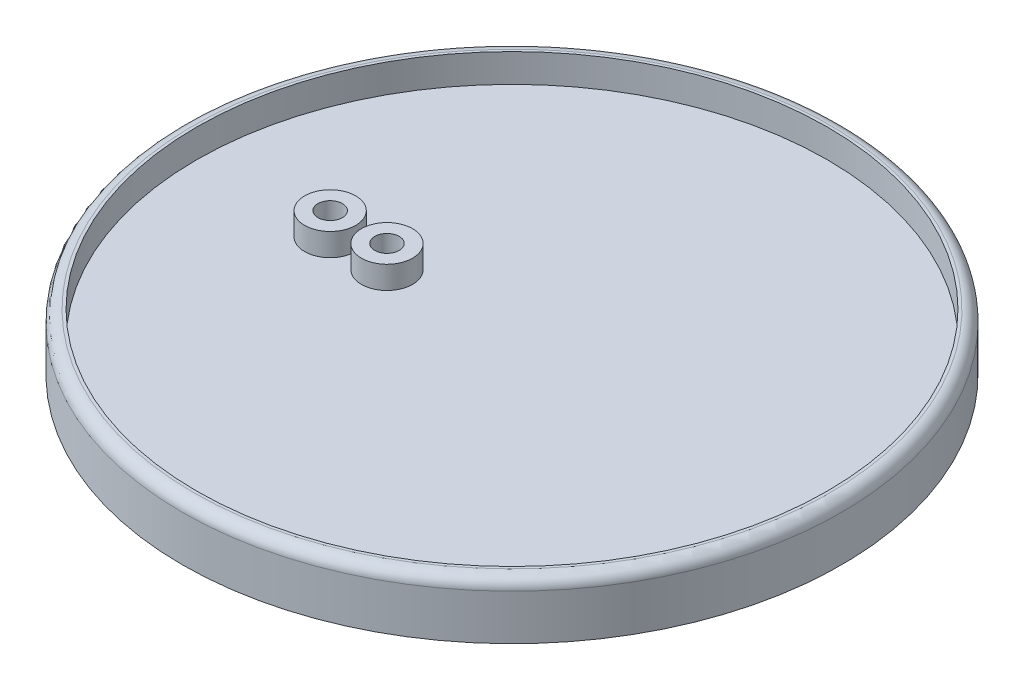
ISO-10303-21;
HEADER;
FILE_DESCRIPTION(('STEP AP214'),'2;1');
FILE_NAME('part.step','',(''),(''),'','','');
FILE_SCHEMA(('AUTOMOTIVE_DESIGN { 1 0 10303 214 1 1 1 1 }'));
ENDSEC;
DATA;
#1=APPLICATION_CONTEXT('core data for automotive mechanical design processes');
#2=APPLICATION_PROTOCOL_DEFINITION('international standard','automotive_design',2000,#1);
#3=PRODUCT_CONTEXT('',#1,'mechanical');
#4=PRODUCT('Part','Part','',(#3));
#5=PRODUCT_RELATED_PRODUCT_CATEGORY('part','',(#4));
#6=PRODUCT_DEFINITION_FORMATION('','',#4);
#7=PRODUCT_DEFINITION_CONTEXT('part definition',#1,'design');
#8=PRODUCT_DEFINITION('design','',#6,#7);
#9=PRODUCT_DEFINITION_SHAPE('','',#8);
#10=(LENGTH_UNIT() NAMED_UNIT(*) SI_UNIT(.MILLI.,.METRE.));
#11=(NAMED_UNIT(*) PLANE_ANGLE_UNIT() SI_UNIT($,.RADIAN.));
#12=(NAMED_UNIT(*) SI_UNIT($,.STERADIAN.) SOLID_ANGLE_UNIT());
#13=UNCERTAINTY_MEASURE_WITH_UNIT(LENGTH_MEASURE(1.E-05),#10,'distance_accuracy_value','');
#14=(GEOMETRIC_REPRESENTATION_CONTEXT(3) GLOBAL_UNCERTAINTY_ASSIGNED_CONTEXT((#13)) GLOBAL_UNIT_ASSIGNED_CONTEXT((#10,
#11,#12)) REPRESENTATION_CONTEXT('',''));
#15=CARTESIAN_POINT('',(0.,0.,0.));
#16=DIRECTION('',(0.,0.,1.));
#17=DIRECTION('',(1.,0.,0.));
#18=AXIS2_PLACEMENT_3D('',#15,#16,#17);
#19=CARTESIAN_POINT('',(0.,5.,0.));
#20=DIRECTION('',(0.,-1.,0.));
#21=DIRECTION('',(0.,0.,-1.));
#22=AXIS2_PLACEMENT_3D('',#19,#20,#21);
#23=CYLINDRICAL_SURFACE('',#22,58.);
#24=CARTESIAN_POINT('',(0.,8.,0.));
#25=DIRECTION('',(0.,1.,0.));
#26=DIRECTION('',(0.,0.,1.));
#27=AXIS2_PLACEMENT_3D('',#24,#25,#26);
#28=CIRCLE('',#27,58.);
#29=CARTESIAN_POINT('',(0.,8.,58.));
#30=VERTEX_POINT('',#29);
#31=EDGE_CURVE('E10',#30,#30,#28,.F.);
#32=ORIENTED_EDGE('',*,*,#31,.T.);
#33=EDGE_LOOP('',(#32));
#34=FACE_BOUND('',#33,.T.);
#35=CARTESIAN_POINT('',(0.,0.,0.));
#36=DIRECTION('',(0.,1.,0.));
#37=DIRECTION('',(0.,0.,1.));
#38=AXIS2_PLACEMENT_3D('',#35,#36,#37);
#39=CIRCLE('',#38,58.);
#40=CARTESIAN_POINT('',(0.,0.,58.));
#41=VERTEX_POINT('',#40);
#42=EDGE_CURVE('E68',#41,#41,#39,.T.);
#43=ORIENTED_EDGE('',*,*,#42,.T.);
#44=EDGE_LOOP('',(#43));
#45=FACE_BOUND('',#44,.T.);
#46=ADVANCED_FACE('F39',(#34,#45),#23,.T.);
#47=CARTESIAN_POINT('',(-22.,0.,0.));
#48=DIRECTION('',(0.,1.,0.));
#49=DIRECTION('',(0.,0.,1.));
#50=AXIS2_PLACEMENT_3D('',#47,#48,#49);
#51=PLANE('',#50);
#52=CARTESIAN_POINT('',(-22.,0.,0.));
#53=DIRECTION('',(0.,1.,0.));
#54=DIRECTION('',(0.,0.,1.));
#55=AXIS2_PLACEMENT_3D('',#52,#53,#54);
#56=CIRCLE('',#55,4.5);
#57=CARTESIAN_POINT('',(-22.,0.,-4.5));
#58=VERTEX_POINT('',#57);
#59=EDGE_CURVE('E93',#58,#58,#56,.T.);
#60=ORIENTED_EDGE('',*,*,#59,.T.);
#61=EDGE_LOOP('',(#60));
#62=FACE_BOUND('',#61,.T.);
#63=CARTESIAN_POINT('',(-32.,0.,0.));
#64=DIRECTION('',(0.,1.,0.));
#65=DIRECTION('',(0.,0.,1.));
#66=AXIS2_PLACEMENT_3D('',#63,#64,#65);
#67=CIRCLE('',#66,4.5);
#68=CARTESIAN_POINT('',(-32.,0.,-4.5));
#69=VERTEX_POINT('',#68);
#70=EDGE_CURVE('E90',#69,#69,#67,.T.);
#71=ORIENTED_EDGE('',*,*,#70,.T.);
#72=EDGE_LOOP('',(#71));
#73=FACE_BOUND('',#72,.T.);
#74=ORIENTED_EDGE('',*,*,#42,.F.);
#75=EDGE_LOOP('',(#74));
#76=FACE_BOUND('',#75,.T.);
#77=ADVANCED_FACE('F114',(#62,#73,#76),#51,.F.);
#78=CARTESIAN_POINT('',(0.,10.,0.));
#79=DIRECTION('',(0.,1.,0.));
#80=DIRECTION('',(0.,0.,1.));
#81=AXIS2_PLACEMENT_3D('',#78,#79,#80);
#82=PLANE('',#81);
#83=CARTESIAN_POINT('',(0.,10.,0.));
#84=DIRECTION('',(0.,1.,0.));
#85=DIRECTION('',(0.,0.,1.));
#86=AXIS2_PLACEMENT_3D('',#83,#84,#85);
#87=CIRCLE('',#86,56.);
#88=CARTESIAN_POINT('',(0.,10.,56.));
#89=VERTEX_POINT('',#88);
#90=EDGE_CURVE('E46',#89,#89,#87,.T.);
#91=ORIENTED_EDGE('',*,*,#90,.T.);
#92=EDGE_LOOP('',(#91));
#93=FACE_BOUND('',#92,.T.);
#94=CARTESIAN_POINT('',(0.,10.,0.));
#95=DIRECTION('',(0.,1.,0.));
#96=DIRECTION('',(0.,0.,1.));
#97=AXIS2_PLACEMENT_3D('',#94,#95,#96);
#98=CIRCLE('',#97,55.5);
#99=CARTESIAN_POINT('',(0.,10.,55.5));
#100=VERTEX_POINT('',#99);
#101=EDGE_CURVE('E78',#100,#100,#98,.T.);
#102=ORIENTED_EDGE('',*,*,#101,.F.);
#103=EDGE_LOOP('',(#102));
#104=FACE_BOUND('',#103,.T.);
#105=ADVANCED_FACE('F119',(#93,#104),#82,.T.);
#106=CARTESIAN_POINT('',(0.,10.,0.));
#107=DIRECTION('',(0.,-1.,0.));
#108=DIRECTION('',(0.,0.,-1.));
#109=AXIS2_PLACEMENT_3D('',#106,#107,#108);
#110=CYLINDRICAL_SURFACE('',#109,55.5);
#111=CARTESIAN_POINT('',(0.,5.,0.));
#112=DIRECTION('',(0.,1.,0.));
#113=DIRECTION('',(0.,0.,1.));
#114=AXIS2_PLACEMENT_3D('',#111,#112,#113);
#115=CIRCLE('',#114,55.5);
#116=CARTESIAN_POINT('',(0.,5.,55.5));
#117=VERTEX_POINT('',#116);
#118=EDGE_CURVE('E50',#117,#117,#115,.F.);
#119=ORIENTED_EDGE('',*,*,#118,.T.);
#120=EDGE_LOOP('',(#119));
#121=FACE_BOUND('',#120,.T.);
#122=ORIENTED_EDGE('',*,*,#101,.T.);
#123=EDGE_LOOP('',(#122));
#124=FACE_BOUND('',#123,.T.);
#125=ADVANCED_FACE('F151',(#121,#124),#110,.F.);
#126=CARTESIAN_POINT('',(-32.,9.,0.));
#127=DIRECTION('',(0.,1.,0.));
#128=DIRECTION('',(0.,0.,1.));
#129=AXIS2_PLACEMENT_3D('',#126,#127,#128);
#130=PLANE('',#129);
#131=CARTESIAN_POINT('',(-32.,9.,0.));
#132=DIRECTION('',(0.,1.,0.));
#133=DIRECTION('',(0.,0.,1.));
#134=AXIS2_PLACEMENT_3D('',#131,#132,#133);
#135=CIRCLE('',#134,2.15);
#136=CARTESIAN_POINT('',(-32.,9.,2.15));
#137=VERTEX_POINT('',#136);
#138=EDGE_CURVE('E60',#137,#137,#135,.T.);
#139=ORIENTED_EDGE('',*,*,#138,.F.);
#140=EDGE_LOOP('',(#139));
#141=FACE_BOUND('',#140,.T.);
#142=CARTESIAN_POINT('',(-32.,9.,0.));
#143=DIRECTION('',(0.,1.,0.));
#144=DIRECTION('',(0.,0.,1.));
#145=AXIS2_PLACEMENT_3D('',#142,#143,#144);
#146=CIRCLE('',#145,4.5);
#147=CARTESIAN_POINT('',(-32.,9.,4.5));
#148=VERTEX_POINT('',#147);
#149=EDGE_CURVE('E76',#148,#148,#146,.T.);
#150=ORIENTED_EDGE('',*,*,#149,.T.);
#151=EDGE_LOOP('',(#150));
#152=FACE_BOUND('',#151,.T.);
#153=ADVANCED_FACE('F130',(#141,#152),#130,.T.);
#154=CARTESIAN_POINT('',(-22.,9.,0.));
#155=DIRECTION('',(0.,1.,0.));
#156=DIRECTION('',(0.,0.,1.));
#157=AXIS2_PLACEMENT_3D('',#154,#155,#156);
#158=PLANE('',#157);
#159=CARTESIAN_POINT('',(-22.,9.,0.));
#160=DIRECTION('',(0.,1.,0.));
#161=DIRECTION('',(0.,0.,1.));
#162=AXIS2_PLACEMENT_3D('',#159,#160,#161);
#163=CIRCLE('',#162,2.15);
#164=CARTESIAN_POINT('',(-22.,9.,2.15));
#165=VERTEX_POINT('',#164);
#166=EDGE_CURVE('E82',#165,#165,#163,.T.);
#167=ORIENTED_EDGE('',*,*,#166,.F.);
#168=EDGE_LOOP('',(#167));
#169=FACE_BOUND('',#168,.T.);
#170=CARTESIAN_POINT('',(-22.,9.,0.));
#171=DIRECTION('',(0.,1.,0.));
#172=DIRECTION('',(0.,0.,1.));
#173=AXIS2_PLACEMENT_3D('',#170,#171,#172);
#174=CIRCLE('',#173,4.5);
#175=CARTESIAN_POINT('',(-22.,9.,4.5));
#176=VERTEX_POINT('',#175);
#177=EDGE_CURVE('E54',#176,#176,#174,.T.);
#178=ORIENTED_EDGE('',*,*,#177,.T.);
#179=EDGE_LOOP('',(#178));
#180=FACE_BOUND('',#179,.T.);
#181=ADVANCED_FACE('F127',(#169,#180),#158,.T.);
#182=CARTESIAN_POINT('',(-32.,9.,0.));
#183=DIRECTION('',(0.,-1.,0.));
#184=DIRECTION('',(0.,0.,-1.));
#185=AXIS2_PLACEMENT_3D('',#182,#183,#184);
#186=CYLINDRICAL_SURFACE('',#185,4.5);
#187=CARTESIAN_POINT('',(-32.,5.,0.));
#188=DIRECTION('',(0.,1.,0.));
#189=DIRECTION('',(0.,0.,1.));
#190=AXIS2_PLACEMENT_3D('',#187,#188,#189);
#191=CIRCLE('',#190,4.5);
#192=CARTESIAN_POINT('',(-32.,5.,4.5));
#193=VERTEX_POINT('',#192);
#194=EDGE_CURVE('E73',#193,#193,#191,.F.);
#195=ORIENTED_EDGE('',*,*,#194,.F.);
#196=EDGE_LOOP('',(#195));
#197=FACE_BOUND('',#196,.T.);
#198=ORIENTED_EDGE('',*,*,#149,.F.);
#199=EDGE_LOOP('',(#198));
#200=FACE_BOUND('',#199,.T.);
#201=ADVANCED_FACE('F129',(#197,#200),#186,.T.);
#202=CARTESIAN_POINT('',(-22.,9.,0.));
#203=DIRECTION('',(0.,-1.,0.));
#204=DIRECTION('',(0.,0.,-1.));
#205=AXIS2_PLACEMENT_3D('',#202,#203,#204);
#206=CYLINDRICAL_SURFACE('',#205,4.5);
#207=CARTESIAN_POINT('',(-22.,5.,0.));
#208=DIRECTION('',(0.,1.,0.));
#209=DIRECTION('',(0.,0.,1.));
#210=AXIS2_PLACEMENT_3D('',#207,#208,#209);
#211=CIRCLE('',#210,4.5);
#212=CARTESIAN_POINT('',(-22.,5.,4.5));
#213=VERTEX_POINT('',#212);
#214=EDGE_CURVE('E65',#213,#213,#211,.T.);
#215=ORIENTED_EDGE('',*,*,#214,.T.);
#216=EDGE_LOOP('',(#215));
#217=FACE_BOUND('',#216,.T.);
#218=ORIENTED_EDGE('',*,*,#177,.F.);
#219=EDGE_LOOP('',(#218));
#220=FACE_BOUND('',#219,.T.);
#221=ADVANCED_FACE('F132',(#217,#220),#206,.T.);
#222=CARTESIAN_POINT('',(0.,5.,0.));
#223=DIRECTION('',(0.,1.,0.));
#224=DIRECTION('',(0.,0.,1.));
#225=AXIS2_PLACEMENT_3D('',#222,#223,#224);
#226=PLANE('',#225);
#227=ORIENTED_EDGE('',*,*,#214,.F.);
#228=EDGE_LOOP('',(#227));
#229=FACE_BOUND('',#228,.T.);
#230=ORIENTED_EDGE('',*,*,#194,.T.);
#231=EDGE_LOOP('',(#230));
#232=FACE_BOUND('',#231,.T.);
#233=ORIENTED_EDGE('',*,*,#118,.F.);
#234=EDGE_LOOP('',(#233));
#235=FACE_BOUND('',#234,.T.);
#236=ADVANCED_FACE('F125',(#229,#232,#235),#226,.T.);
#237=CARTESIAN_POINT('',(-22.,9.,0.));
#238=DIRECTION('',(0.,-1.,0.));
#239=DIRECTION('',(0.,0.,-1.));
#240=AXIS2_PLACEMENT_3D('',#237,#238,#239);
#241=CYLINDRICAL_SURFACE('',#240,2.15);
#242=CARTESIAN_POINT('',(-22.,2.7,0.));
#243=DIRECTION('',(0.,1.,0.));
#244=DIRECTION('',(0.,0.,1.));
#245=AXIS2_PLACEMENT_3D('',#242,#243,#244);
#246=CIRCLE('',#245,2.15);
#247=CARTESIAN_POINT('',(-22.,2.7,2.15));
#248=VERTEX_POINT('',#247);
#249=EDGE_CURVE('E57',#248,#248,#246,.T.);
#250=ORIENTED_EDGE('',*,*,#249,.F.);
#251=EDGE_LOOP('',(#250));
#252=FACE_BOUND('',#251,.T.);
#253=ORIENTED_EDGE('',*,*,#166,.T.);
#254=EDGE_LOOP('',(#253));
#255=FACE_BOUND('',#254,.T.);
#256=ADVANCED_FACE('F139',(#252,#255),#241,.F.);
#257=CARTESIAN_POINT('',(-32.,9.,0.));
#258=DIRECTION('',(0.,-1.,0.));
#259=DIRECTION('',(0.,0.,-1.));
#260=AXIS2_PLACEMENT_3D('',#257,#258,#259);
#261=CYLINDRICAL_SURFACE('',#260,2.15);
#262=CARTESIAN_POINT('',(-32.,2.7,0.));
#263=DIRECTION('',(0.,1.,0.));
#264=DIRECTION('',(0.,0.,1.));
#265=AXIS2_PLACEMENT_3D('',#262,#263,#264);
#266=CIRCLE('',#265,2.15);
#267=CARTESIAN_POINT('',(-32.,2.7,2.15));
#268=VERTEX_POINT('',#267);
#269=EDGE_CURVE('E61',#268,#268,#266,.T.);
#270=ORIENTED_EDGE('',*,*,#269,.F.);
#271=EDGE_LOOP('',(#270));
#272=FACE_BOUND('',#271,.T.);
#273=ORIENTED_EDGE('',*,*,#138,.T.);
#274=EDGE_LOOP('',(#273));
#275=FACE_BOUND('',#274,.T.);
#276=ADVANCED_FACE('F172',(#272,#275),#261,.F.);
#277=CARTESIAN_POINT('',(-32.,2.7,0.));
#278=DIRECTION('',(0.,-1.,0.));
#279=DIRECTION('',(0.,0.,-1.));
#280=AXIS2_PLACEMENT_3D('',#277,#278,#279);
#281=CYLINDRICAL_SURFACE('',#280,4.5);
#282=CARTESIAN_POINT('',(-32.,2.7,0.));
#283=DIRECTION('',(0.,1.,0.));
#284=DIRECTION('',(0.,0.,1.));
#285=AXIS2_PLACEMENT_3D('',#282,#283,#284);
#286=CIRCLE('',#285,4.5);
#287=CARTESIAN_POINT('',(-32.,2.7,-4.5));
#288=VERTEX_POINT('',#287);
#289=EDGE_CURVE('E87',#288,#288,#286,.T.);
#290=CARTESIAN_POINT('',(-32.,2.7,-4.5));
#291=CARTESIAN_POINT('',(-32.,2.671875,-4.5));
#292=CARTESIAN_POINT('',(-32.,2.64375,-4.5));
#293=CARTESIAN_POINT('',(-32.,2.5875,-4.5));
#294=CARTESIAN_POINT('',(-32.,2.559375,-4.5));
#295=CARTESIAN_POINT('',(-32.,2.503125,-4.5));
#296=CARTESIAN_POINT('',(-32.,2.475,-4.5));
#297=CARTESIAN_POINT('',(-32.,2.41875,-4.5));
#298=CARTESIAN_POINT('',(-32.,2.390625,-4.5));
#299=CARTESIAN_POINT('',(-32.,2.334375,-4.5));
#300=CARTESIAN_POINT('',(-32.,2.30625,-4.5));
#301=CARTESIAN_POINT('',(-32.,2.25,-4.5));
#302=CARTESIAN_POINT('',(-32.,2.221875,-4.5));
#303=CARTESIAN_POINT('',(-32.,2.165625,-4.5));
#304=CARTESIAN_POINT('',(-32.,2.1375,-4.5));
#305=CARTESIAN_POINT('',(-32.,2.08125,-4.5));
#306=CARTESIAN_POINT('',(-32.,2.053125,-4.5));
#307=CARTESIAN_POINT('',(-32.,1.996875,-4.5));
#308=CARTESIAN_POINT('',(-32.,1.96875,-4.5));
#309=CARTESIAN_POINT('',(-32.,1.9125,-4.5));
#310=CARTESIAN_POINT('',(-32.,1.884375,-4.5));
#311=CARTESIAN_POINT('',(-32.,1.828125,-4.5));
#312=CARTESIAN_POINT('',(-32.,1.8,-4.5));
#313=CARTESIAN_POINT('',(-32.,1.74375,-4.5));
#314=CARTESIAN_POINT('',(-32.,1.715625,-4.5));
#315=CARTESIAN_POINT('',(-32.,1.659375,-4.5));
#316=CARTESIAN_POINT('',(-32.,1.63125,-4.5));
#317=CARTESIAN_POINT('',(-32.,1.575,-4.5));
#318=CARTESIAN_POINT('',(-32.,1.546875,-4.5));
#319=CARTESIAN_POINT('',(-32.,1.490625,-4.5));
#320=CARTESIAN_POINT('',(-32.,1.4625,-4.5));
#321=CARTESIAN_POINT('',(-32.,1.40625,-4.5));
#322=CARTESIAN_POINT('',(-32.,1.378125,-4.5));
#323=CARTESIAN_POINT('',(-32.,1.321875,-4.5));
#324=CARTESIAN_POINT('',(-32.,1.29375,-4.5));
#325=CARTESIAN_POINT('',(-32.,1.2375,-4.5));
#326=CARTESIAN_POINT('',(-32.,1.209375,-4.5));
#327=CARTESIAN_POINT('',(-32.,1.153125,-4.5));
#328=CARTESIAN_POINT('',(-32.,1.125,-4.5));
#329=CARTESIAN_POINT('',(-32.,1.06875,-4.5));
#330=CARTESIAN_POINT('',(-32.,1.040625,-4.5));
#331=CARTESIAN_POINT('',(-32.,0.984375,-4.5));
#332=CARTESIAN_POINT('',(-32.,0.956249999999999,-4.5));
#333=CARTESIAN_POINT('',(-32.,0.899999999999999,-4.5));
#334=CARTESIAN_POINT('',(-32.,0.871875,-4.5));
#335=CARTESIAN_POINT('',(-32.,0.815624999999999,-4.5));
#336=CARTESIAN_POINT('',(-32.,0.787499999999999,-4.5));
#337=CARTESIAN_POINT('',(-32.,0.73125,-4.5));
#338=CARTESIAN_POINT('',(-32.,0.703125,-4.5));
#339=CARTESIAN_POINT('',(-32.,0.646875,-4.5));
#340=CARTESIAN_POINT('',(-32.,0.61875,-4.5));
#341=CARTESIAN_POINT('',(-32.,0.5625,-4.5));
#342=CARTESIAN_POINT('',(-32.,0.534375,-4.5));
#343=CARTESIAN_POINT('',(-32.,0.478125,-4.5));
#344=CARTESIAN_POINT('',(-32.,0.45,-4.5));
#345=CARTESIAN_POINT('',(-32.,0.39375,-4.5));
#346=CARTESIAN_POINT('',(-32.,0.365625,-4.5));
#347=CARTESIAN_POINT('',(-32.,0.309375,-4.5));
#348=CARTESIAN_POINT('',(-32.,0.28125,-4.5));
#349=CARTESIAN_POINT('',(-32.,0.225,-4.5));
#350=CARTESIAN_POINT('',(-32.,0.196875,-4.5));
#351=CARTESIAN_POINT('',(-32.,0.140625,-4.5));
#352=CARTESIAN_POINT('',(-32.,0.1125,-4.5));
#353=CARTESIAN_POINT('',(-32.,0.0562499999999997,-4.5));
#354=CARTESIAN_POINT('',(-32.,0.0281249999999996,-4.5));
#355=CARTESIAN_POINT('',(-32.,0.,-4.5));
#356=B_SPLINE_CURVE_WITH_KNOTS('',3,(#290,#291,#292,#293,#294,#295,#296,#297,#298,#299,#300,
#301,#302,#303,#304,#305,#306,#307,#308,#309,#310,#311,#312,#313,#314,#315,#316,#317,#318,#319,
#320,#321,#322,#323,#324,#325,#326,#327,#328,#329,#330,#331,#332,#333,#334,#335,#336,#337,#338,
#339,#340,#341,#342,#343,#344,#345,#346,#347,#348,#349,#350,#351,#352,#353,#354,#355),
.UNSPECIFIED.,.F.,.F.,(4,2,2,2,2,2,2,2,2,2,2,2,2,2,2,2,2,2,2,2,2,2,2,2,2,2,2,2,2,2,2,2,4),(0.,
0.0843750000000003,0.16875,0.253125,0.3375,0.421875,0.50625,0.590625,0.675,0.759375,0.84375,
0.928125000000001,1.0125,1.096875,1.18125,1.265625,1.35,1.434375,1.51875,1.603125,1.6875,
1.771875,1.85625,1.940625,2.025,2.109375,2.19375,2.278125,2.3625,2.446875,2.53125,2.615625,2.7),.UNSPECIFIED.);
#357=EDGE_CURVE('BSEAM174',#288,#69,#356,.T.);
#358=ORIENTED_EDGE('',*,*,#289,.T.);
#359=ORIENTED_EDGE('',*,*,#70,.F.);
#360=ORIENTED_EDGE('',*,*,#357,.T.);
#361=ORIENTED_EDGE('',*,*,#357,.F.);
#362=EDGE_LOOP('',(#358,#360,#359,#361));
#363=FACE_BOUND('',#362,.T.);
#364=ADVANCED_FACE('F174',(#363),#281,.F.);
#365=CARTESIAN_POINT('',(-32.,2.7,0.));
#366=DIRECTION('',(0.,1.,0.));
#367=DIRECTION('',(0.,0.,1.));
#368=AXIS2_PLACEMENT_3D('',#365,#366,#367);
#369=PLANE('',#368);
#370=ORIENTED_EDGE('',*,*,#269,.T.);
#371=EDGE_LOOP('',(#370));
#372=FACE_BOUND('',#371,.T.);
#373=ORIENTED_EDGE('',*,*,#289,.F.);
#374=EDGE_LOOP('',(#373));
#375=FACE_BOUND('',#374,.T.);
#376=ADVANCED_FACE('F111',(#372,#375),#369,.F.);
#377=CARTESIAN_POINT('',(-22.,2.7,0.));
#378=DIRECTION('',(0.,-1.,0.));
#379=DIRECTION('',(0.,0.,-1.));
#380=AXIS2_PLACEMENT_3D('',#377,#378,#379);
#381=CYLINDRICAL_SURFACE('',#380,4.5);
#382=CARTESIAN_POINT('',(-22.,2.7,0.));
#383=DIRECTION('',(0.,1.,0.));
#384=DIRECTION('',(0.,0.,1.));
#385=AXIS2_PLACEMENT_3D('',#382,#383,#384);
#386=CIRCLE('',#385,4.5);
#387=CARTESIAN_POINT('',(-22.,2.7,-4.5));
#388=VERTEX_POINT('',#387);
#389=EDGE_CURVE('E64',#388,#388,#386,.T.);
#390=CARTESIAN_POINT('',(-22.,2.7,-4.5));
#391=CARTESIAN_POINT('',(-22.,2.671875,-4.5));
#392=CARTESIAN_POINT('',(-22.,2.64375,-4.5));
#393=CARTESIAN_POINT('',(-22.,2.5875,-4.5));
#394=CARTESIAN_POINT('',(-22.,2.559375,-4.5));
#395=CARTESIAN_POINT('',(-22.,2.503125,-4.5));
#396=CARTESIAN_POINT('',(-22.,2.475,-4.5));
#397=CARTESIAN_POINT('',(-22.,2.41875,-4.5));
#398=CARTESIAN_POINT('',(-22.,2.390625,-4.5));
#399=CARTESIAN_POINT('',(-22.,2.334375,-4.5));
#400=CARTESIAN_POINT('',(-22.,2.30625,-4.5));
#401=CARTESIAN_POINT('',(-22.,2.25,-4.5));
#402=CARTESIAN_POINT('',(-22.,2.221875,-4.5));
#403=CARTESIAN_POINT('',(-22.,2.165625,-4.5));
#404=CARTESIAN_POINT('',(-22.,2.1375,-4.5));
#405=CARTESIAN_POINT('',(-22.,2.08125,-4.5));
#406=CARTESIAN_POINT('',(-22.,2.053125,-4.5));
#407=CARTESIAN_POINT('',(-22.,1.996875,-4.5));
#408=CARTESIAN_POINT('',(-22.,1.96875,-4.5));
#409=CARTESIAN_POINT('',(-22.,1.9125,-4.5));
#410=CARTESIAN_POINT('',(-22.,1.884375,-4.5));
#411=CARTESIAN_POINT('',(-22.,1.828125,-4.5));
#412=CARTESIAN_POINT('',(-22.,1.8,-4.5));
#413=CARTESIAN_POINT('',(-22.,1.74375,-4.5));
#414=CARTESIAN_POINT('',(-22.,1.715625,-4.5));
#415=CARTESIAN_POINT('',(-22.,1.659375,-4.5));
#416=CARTESIAN_POINT('',(-22.,1.63125,-4.5));
#417=CARTESIAN_POINT('',(-22.,1.575,-4.5));
#418=CARTESIAN_POINT('',(-22.,1.546875,-4.5));
#419=CARTESIAN_POINT('',(-22.,1.490625,-4.5));
#420=CARTESIAN_POINT('',(-22.,1.4625,-4.5));
#421=CARTESIAN_POINT('',(-22.,1.40625,-4.5));
#422=CARTESIAN_POINT('',(-22.,1.378125,-4.5));
#423=CARTESIAN_POINT('',(-22.,1.321875,-4.5));
#424=CARTESIAN_POINT('',(-22.,1.29375,-4.5));
#425=CARTESIAN_POINT('',(-22.,1.2375,-4.5));
#426=CARTESIAN_POINT('',(-22.,1.209375,-4.5));
#427=CARTESIAN_POINT('',(-22.,1.153125,-4.5));
#428=CARTESIAN_POINT('',(-22.,1.125,-4.5));
#429=CARTESIAN_POINT('',(-22.,1.06875,-4.5));
#430=CARTESIAN_POINT('',(-22.,1.040625,-4.5));
#431=CARTESIAN_POINT('',(-22.,0.984375,-4.5));
#432=CARTESIAN_POINT('',(-22.,0.956249999999999,-4.5));
#433=CARTESIAN_POINT('',(-22.,0.899999999999999,-4.5));
#434=CARTESIAN_POINT('',(-22.,0.871875,-4.5));
#435=CARTESIAN_POINT('',(-22.,0.815624999999999,-4.5));
#436=CARTESIAN_POINT('',(-22.,0.787499999999999,-4.5));
#437=CARTESIAN_POINT('',(-22.,0.73125,-4.5));
#438=CARTESIAN_POINT('',(-22.,0.703125,-4.5));
#439=CARTESIAN_POINT('',(-22.,0.646875,-4.5));
#440=CARTESIAN_POINT('',(-22.,0.61875,-4.5));
#441=CARTESIAN_POINT('',(-22.,0.5625,-4.5));
#442=CARTESIAN_POINT('',(-22.,0.534375,-4.5));
#443=CARTESIAN_POINT('',(-22.,0.478125,-4.5));
#444=CARTESIAN_POINT('',(-22.,0.45,-4.5));
#445=CARTESIAN_POINT('',(-22.,0.39375,-4.5));
#446=CARTESIAN_POINT('',(-22.,0.365625,-4.5));
#447=CARTESIAN_POINT('',(-22.,0.309375,-4.5));
#448=CARTESIAN_POINT('',(-22.,0.28125,-4.5));
#449=CARTESIAN_POINT('',(-22.,0.225,-4.5));
#450=CARTESIAN_POINT('',(-22.,0.196875,-4.5));
#451=CARTESIAN_POINT('',(-22.,0.140625,-4.5));
#452=CARTESIAN_POINT('',(-22.,0.1125,-4.5));
#453=CARTESIAN_POINT('',(-22.,0.0562499999999997,-4.5));
#454=CARTESIAN_POINT('',(-22.,0.0281249999999996,-4.5));
#455=CARTESIAN_POINT('',(-22.,0.,-4.5));
#456=B_SPLINE_CURVE_WITH_KNOTS('',3,(#390,#391,#392,#393,#394,#395,#396,#397,#398,#399,#400,
#401,#402,#403,#404,#405,#406,#407,#408,#409,#410,#411,#412,#413,#414,#415,#416,#417,#418,#419,
#420,#421,#422,#423,#424,#425,#426,#427,#428,#429,#430,#431,#432,#433,#434,#435,#436,#437,#438,
#439,#440,#441,#442,#443,#444,#445,#446,#447,#448,#449,#450,#451,#452,#453,#454,#455),
.UNSPECIFIED.,.F.,.F.,(4,2,2,2,2,2,2,2,2,2,2,2,2,2,2,2,2,2,2,2,2,2,2,2,2,2,2,2,2,2,2,2,4),(0.,
0.0843750000000003,0.16875,0.253125,0.3375,0.421875,0.50625,0.590625,0.675,0.759375,0.84375,
0.928125000000001,1.0125,1.096875,1.18125,1.265625,1.35,1.434375,1.51875,1.603125,1.6875,
1.771875,1.85625,1.940625,2.025,2.109375,2.19375,2.278125,2.3625,2.446875,2.53125,2.615625,2.7),.UNSPECIFIED.);
#457=EDGE_CURVE('BSEAM99',#388,#58,#456,.T.);
#458=ORIENTED_EDGE('',*,*,#389,.T.);
#459=ORIENTED_EDGE('',*,*,#59,.F.);
#460=ORIENTED_EDGE('',*,*,#457,.T.);
#461=ORIENTED_EDGE('',*,*,#457,.F.);
#462=EDGE_LOOP('',(#458,#460,#459,#461));
#463=FACE_BOUND('',#462,.T.);
#464=ADVANCED_FACE('F99',(#463),#381,.F.);
#465=CARTESIAN_POINT('',(-22.,2.7,0.));
#466=DIRECTION('',(0.,1.,0.));
#467=DIRECTION('',(0.,0.,1.));
#468=AXIS2_PLACEMENT_3D('',#465,#466,#467);
#469=PLANE('',#468);
#470=ORIENTED_EDGE('',*,*,#249,.T.);
#471=EDGE_LOOP('',(#470));
#472=FACE_BOUND('',#471,.T.);
#473=ORIENTED_EDGE('',*,*,#389,.F.);
#474=EDGE_LOOP('',(#473));
#475=FACE_BOUND('',#474,.T.);
#476=ADVANCED_FACE('F102',(#472,#475),#469,.F.);
#477=CARTESIAN_POINT('',(0.,8.,0.));
#478=DIRECTION('',(0.,1.,0.));
#479=DIRECTION('',(0.,0.,1.));
#480=AXIS2_PLACEMENT_3D('',#477,#478,#479);
#481=TOROIDAL_SURFACE('',#480,56.,2.);
#482=ORIENTED_EDGE('',*,*,#31,.F.);
#483=EDGE_LOOP('',(#482));
#484=FACE_BOUND('',#483,.T.);
#485=ORIENTED_EDGE('',*,*,#90,.F.);
#486=EDGE_LOOP('',(#485));
#487=FACE_BOUND('',#486,.T.);
#488=ADVANCED_FACE('F41',(#484,#487),#481,.T.);
#489=CLOSED_SHELL('',(#46,#77,#105,#125,#153,#181,#201,#221,#236,#256,#276,#364,#376,#464,#476,#488));
#490=MANIFOLD_SOLID_BREP('B2',#489);
#491=ADVANCED_BREP_SHAPE_REPRESENTATION('',(#18,#490),#14);
#492=SHAPE_DEFINITION_REPRESENTATION(#9,#491);
ENDSEC;
END-ISO-10303-21;
